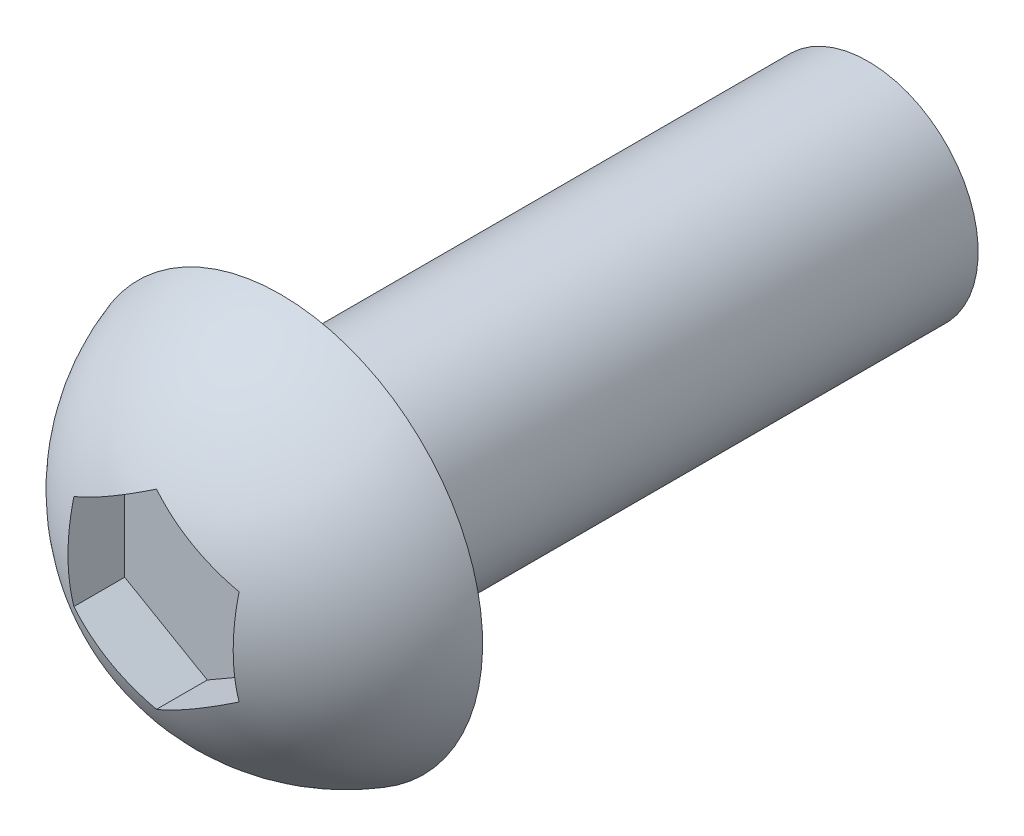
ISO-10303-21;
HEADER;
FILE_DESCRIPTION(('STEP AP214'),'2;1');
FILE_NAME('part.step','',(''),(''),'','','');
FILE_SCHEMA(('AUTOMOTIVE_DESIGN { 1 0 10303 214 1 1 1 1 }'));
ENDSEC;
DATA;
#1=APPLICATION_CONTEXT('core data for automotive mechanical design processes');
#2=APPLICATION_PROTOCOL_DEFINITION('international standard','automotive_design',2000,#1);
#3=PRODUCT_CONTEXT('',#1,'mechanical');
#4=PRODUCT('Part','Part','',(#3));
#5=PRODUCT_RELATED_PRODUCT_CATEGORY('part','',(#4));
#6=PRODUCT_DEFINITION_FORMATION('','',#4);
#7=PRODUCT_DEFINITION_CONTEXT('part definition',#1,'design');
#8=PRODUCT_DEFINITION('design','',#6,#7);
#9=PRODUCT_DEFINITION_SHAPE('','',#8);
#10=(LENGTH_UNIT() NAMED_UNIT(*) SI_UNIT(.MILLI.,.METRE.));
#11=(NAMED_UNIT(*) PLANE_ANGLE_UNIT() SI_UNIT($,.RADIAN.));
#12=(NAMED_UNIT(*) SI_UNIT($,.STERADIAN.) SOLID_ANGLE_UNIT());
#13=UNCERTAINTY_MEASURE_WITH_UNIT(LENGTH_MEASURE(1.E-05),#10,'distance_accuracy_value','');
#14=(GEOMETRIC_REPRESENTATION_CONTEXT(3) GLOBAL_UNCERTAINTY_ASSIGNED_CONTEXT((#13)) GLOBAL_UNIT_ASSIGNED_CONTEXT((#10,
#11,#12)) REPRESENTATION_CONTEXT('',''));
#15=CARTESIAN_POINT('',(0.,0.,0.));
#16=DIRECTION('',(0.,0.,1.));
#17=DIRECTION('',(1.,0.,0.));
#18=AXIS2_PLACEMENT_3D('',#15,#16,#17);
#19=CARTESIAN_POINT('',(0.,0.,-5.));
#20=DIRECTION('',(0.,0.,-1.));
#21=DIRECTION('',(-1.,0.,0.));
#22=AXIS2_PLACEMENT_3D('',#19,#20,#21);
#23=PLANE('',#22);
#24=CARTESIAN_POINT('',(0.,0.,-5.));
#25=DIRECTION('',(0.,0.,-1.));
#26=DIRECTION('',(-1.,0.,0.));
#27=AXIS2_PLACEMENT_3D('',#24,#25,#26);
#28=CIRCLE('',#27,1.5);
#29=CARTESIAN_POINT('',(-1.5,0.,-5.));
#30=VERTEX_POINT('',#29);
#31=EDGE_CURVE('E157',#30,#30,#28,.T.);
#32=ORIENTED_EDGE('',*,*,#31,.T.);
#33=EDGE_LOOP('',(#32));
#34=FACE_BOUND('',#33,.T.);
#35=ADVANCED_FACE('F45',(#34),#23,.T.);
#36=CARTESIAN_POINT('',(0.,0.,3.));
#37=DIRECTION('',(0.,0.,-1.));
#38=DIRECTION('',(-1.,0.,0.));
#39=AXIS2_PLACEMENT_3D('',#36,#37,#38);
#40=CYLINDRICAL_SURFACE('',#39,1.5);
#41=CARTESIAN_POINT('',(0.,0.,3.));
#42=DIRECTION('',(0.,0.,-1.));
#43=DIRECTION('',(-1.,0.,0.));
#44=AXIS2_PLACEMENT_3D('',#41,#42,#43);
#45=CIRCLE('',#44,1.5);
#46=CARTESIAN_POINT('',(-1.5,0.,3.));
#47=VERTEX_POINT('',#46);
#48=EDGE_CURVE('E153',#47,#47,#45,.T.);
#49=ORIENTED_EDGE('',*,*,#48,.T.);
#50=EDGE_LOOP('',(#49));
#51=FACE_BOUND('',#50,.T.);
#52=ORIENTED_EDGE('',*,*,#31,.F.);
#53=EDGE_LOOP('',(#52));
#54=FACE_BOUND('',#53,.T.);
#55=ADVANCED_FACE('F197',(#51,#54),#40,.T.);
#56=CARTESIAN_POINT('',(0.,1.5,3.));
#57=DIRECTION('',(0.,0.,-1.));
#58=DIRECTION('',(-1.,0.,0.));
#59=AXIS2_PLACEMENT_3D('',#56,#57,#58);
#60=PLANE('',#59);
#61=CARTESIAN_POINT('',(0.,0.,3.));
#62=DIRECTION('',(0.,0.,-1.));
#63=DIRECTION('',(-1.,0.,0.));
#64=AXIS2_PLACEMENT_3D('',#61,#62,#63);
#65=CIRCLE('',#64,2.75);
#66=CARTESIAN_POINT('',(-2.75,0.,3.));
#67=VERTEX_POINT('',#66);
#68=EDGE_CURVE('E136',#67,#67,#65,.T.);
#69=ORIENTED_EDGE('',*,*,#68,.T.);
#70=EDGE_LOOP('',(#69));
#71=FACE_BOUND('',#70,.T.);
#72=ORIENTED_EDGE('',*,*,#48,.F.);
#73=EDGE_LOOP('',(#72));
#74=FACE_BOUND('',#73,.T.);
#75=ADVANCED_FACE('F202',(#71,#74),#60,.T.);
#76=CARTESIAN_POINT('',(0.,0.,2.109375));
#77=DIRECTION('',(0.,0.,-1.));
#78=DIRECTION('',(0.,1.,0.));
#79=AXIS2_PLACEMENT_3D('',#76,#77,#78);
#80=SPHERICAL_SURFACE('',#79,2.890625);
#81=CARTESIAN_POINT('',(0.5625,0.974278579257494,2.109375));
#82=DIRECTION('',(0.5,0.866025403784439,0.));
#83=DIRECTION('',(-0.866025403784439,0.5,0.));
#84=AXIS2_PLACEMENT_3D('',#81,#82,#83);
#85=CIRCLE('',#84,2.66272189509626);
#86=CARTESIAN_POINT('',(1.125,0.649519052838329,4.69166330509395));
#87=VERTEX_POINT('',#86);
#88=CARTESIAN_POINT('',(0.,1.29903810567666,4.69166330509395));
#89=VERTEX_POINT('',#88);
#90=EDGE_CURVE('E11',#87,#89,#85,.F.);
#91=ORIENTED_EDGE('',*,*,#90,.F.);
#92=CARTESIAN_POINT('',(1.125,0.,2.109375));
#93=DIRECTION('',(1.,0.,0.));
#94=DIRECTION('',(0.,0.,-1.));
#95=AXIS2_PLACEMENT_3D('',#92,#93,#94);
#96=CIRCLE('',#95,2.66272189509626);
#97=CARTESIAN_POINT('',(1.125,-0.649519052838329,4.69166330509395));
#98=VERTEX_POINT('',#97);
#99=EDGE_CURVE('E53',#98,#87,#96,.F.);
#100=ORIENTED_EDGE('',*,*,#99,.F.);
#101=CARTESIAN_POINT('',(0.5625,-0.974278579257494,2.109375));
#102=DIRECTION('',(0.5,-0.866025403784439,0.));
#103=DIRECTION('',(0.866025403784439,0.5,0.));
#104=AXIS2_PLACEMENT_3D('',#101,#102,#103);
#105=CIRCLE('',#104,2.66272189509626);
#106=CARTESIAN_POINT('',(0.,-1.29903810567666,4.69166330509395));
#107=VERTEX_POINT('',#106);
#108=EDGE_CURVE('E170',#107,#98,#105,.F.);
#109=ORIENTED_EDGE('',*,*,#108,.F.);
#110=CARTESIAN_POINT('',(-0.5625,-0.974278579257495,2.109375));
#111=DIRECTION('',(-0.5,-0.866025403784439,0.));
#112=DIRECTION('',(0.866025403784439,-0.5,0.));
#113=AXIS2_PLACEMENT_3D('',#110,#111,#112);
#114=CIRCLE('',#113,2.66272189509626);
#115=CARTESIAN_POINT('',(-1.125,-0.64951905283833,4.69166330509395));
#116=VERTEX_POINT('',#115);
#117=EDGE_CURVE('E167',#116,#107,#114,.F.);
#118=ORIENTED_EDGE('',*,*,#117,.F.);
#119=CARTESIAN_POINT('',(-1.125,0.,2.109375));
#120=DIRECTION('',(-1.,0.,0.));
#121=DIRECTION('',(0.,0.,1.));
#122=AXIS2_PLACEMENT_3D('',#119,#120,#121);
#123=CIRCLE('',#122,2.66272189509626);
#124=CARTESIAN_POINT('',(-1.125,0.649519052838329,4.69166330509395));
#125=VERTEX_POINT('',#124);
#126=EDGE_CURVE('E164',#125,#116,#123,.F.);
#127=ORIENTED_EDGE('',*,*,#126,.F.);
#128=CARTESIAN_POINT('',(-0.5625,0.974278579257494,2.109375));
#129=DIRECTION('',(-0.5,0.866025403784439,0.));
#130=DIRECTION('',(-0.866025403784438,-0.5,0.));
#131=AXIS2_PLACEMENT_3D('',#128,#129,#130);
#132=CIRCLE('',#131,2.66272189509626);
#133=EDGE_CURVE('E161',#89,#125,#132,.F.);
#134=ORIENTED_EDGE('',*,*,#133,.F.);
#135=EDGE_LOOP('',(#91,#100,#109,#118,#127,#134));
#136=FACE_BOUND('',#135,.T.);
#137=ORIENTED_EDGE('',*,*,#68,.F.);
#138=EDGE_LOOP('',(#137));
#139=FACE_BOUND('',#138,.T.);
#140=ADVANCED_FACE('F180',(#136,#139),#80,.T.);
#141=CARTESIAN_POINT('',(1.125,0.649519052838329,4.));
#142=DIRECTION('',(0.5,0.866025403784439,0.));
#143=DIRECTION('',(-0.866025403784439,0.5,0.));
#144=AXIS2_PLACEMENT_3D('',#141,#142,#143);
#145=PLANE('',#144);
#146=ORIENTED_EDGE('',*,*,#90,.T.);
#147=DIRECTION('',(0.,0.,1.));
#148=VECTOR('',#147,1.);
#149=CARTESIAN_POINT('',(0.,1.29903810567666,4.));
#150=LINE('',#149,#148);
#151=CARTESIAN_POINT('',(0.,1.29903810567666,4.));
#152=VERTEX_POINT('',#151);
#153=EDGE_CURVE('E60',#152,#89,#150,.T.);
#154=ORIENTED_EDGE('',*,*,#153,.F.);
#155=DIRECTION('',(-0.866025403784439,0.5,0.));
#156=VECTOR('',#155,1.);
#157=CARTESIAN_POINT('',(1.125,0.649519052838329,4.));
#158=LINE('',#157,#156);
#159=CARTESIAN_POINT('',(1.125,0.649519052838329,4.));
#160=VERTEX_POINT('',#159);
#161=EDGE_CURVE('E98',#160,#152,#158,.T.);
#162=ORIENTED_EDGE('',*,*,#161,.F.);
#163=DIRECTION('',(0.,0.,1.));
#164=VECTOR('',#163,1.);
#165=CARTESIAN_POINT('',(1.125,0.649519052838329,4.));
#166=LINE('',#165,#164);
#167=EDGE_CURVE('E133',#160,#87,#166,.T.);
#168=ORIENTED_EDGE('',*,*,#167,.T.);
#169=EDGE_LOOP('',(#146,#154,#162,#168));
#170=FACE_BOUND('',#169,.T.);
#171=ADVANCED_FACE('F96',(#170),#145,.F.);
#172=CARTESIAN_POINT('',(1.125,-0.649519052838329,4.));
#173=DIRECTION('',(1.,0.,0.));
#174=DIRECTION('',(0.,0.,-1.));
#175=AXIS2_PLACEMENT_3D('',#172,#173,#174);
#176=PLANE('',#175);
#177=ORIENTED_EDGE('',*,*,#99,.T.);
#178=ORIENTED_EDGE('',*,*,#167,.F.);
#179=DIRECTION('',(0.,1.,0.));
#180=VECTOR('',#179,1.);
#181=CARTESIAN_POINT('',(1.125,-0.649519052838329,4.));
#182=LINE('',#181,#180);
#183=CARTESIAN_POINT('',(1.125,-0.649519052838329,4.));
#184=VERTEX_POINT('',#183);
#185=EDGE_CURVE('E104',#184,#160,#182,.T.);
#186=ORIENTED_EDGE('',*,*,#185,.F.);
#187=DIRECTION('',(0.,0.,1.));
#188=VECTOR('',#187,1.);
#189=CARTESIAN_POINT('',(1.125,-0.649519052838329,4.));
#190=LINE('',#189,#188);
#191=EDGE_CURVE('E137',#184,#98,#190,.T.);
#192=ORIENTED_EDGE('',*,*,#191,.T.);
#193=EDGE_LOOP('',(#177,#178,#186,#192));
#194=FACE_BOUND('',#193,.T.);
#195=ADVANCED_FACE('F179',(#194),#176,.F.);
#196=CARTESIAN_POINT('',(0.,-1.29903810567666,4.));
#197=DIRECTION('',(0.5,-0.866025403784439,0.));
#198=DIRECTION('',(0.866025403784439,0.5,0.));
#199=AXIS2_PLACEMENT_3D('',#196,#197,#198);
#200=PLANE('',#199);
#201=ORIENTED_EDGE('',*,*,#108,.T.);
#202=ORIENTED_EDGE('',*,*,#191,.F.);
#203=DIRECTION('',(0.866025403784439,0.5,0.));
#204=VECTOR('',#203,1.);
#205=CARTESIAN_POINT('',(0.,-1.29903810567666,4.));
#206=LINE('',#205,#204);
#207=CARTESIAN_POINT('',(0.,-1.29903810567666,4.));
#208=VERTEX_POINT('',#207);
#209=EDGE_CURVE('E128',#208,#184,#206,.T.);
#210=ORIENTED_EDGE('',*,*,#209,.F.);
#211=DIRECTION('',(0.,0.,1.));
#212=VECTOR('',#211,1.);
#213=CARTESIAN_POINT('',(0.,-1.29903810567666,4.));
#214=LINE('',#213,#212);
#215=EDGE_CURVE('E140',#208,#107,#214,.T.);
#216=ORIENTED_EDGE('',*,*,#215,.T.);
#217=EDGE_LOOP('',(#201,#202,#210,#216));
#218=FACE_BOUND('',#217,.T.);
#219=ADVANCED_FACE('F175',(#218),#200,.F.);
#220=CARTESIAN_POINT('',(-1.125,-0.64951905283833,4.));
#221=DIRECTION('',(-0.5,-0.866025403784439,0.));
#222=DIRECTION('',(0.866025403784439,-0.5,0.));
#223=AXIS2_PLACEMENT_3D('',#220,#221,#222);
#224=PLANE('',#223);
#225=ORIENTED_EDGE('',*,*,#117,.T.);
#226=ORIENTED_EDGE('',*,*,#215,.F.);
#227=DIRECTION('',(0.866025403784439,-0.5,0.));
#228=VECTOR('',#227,1.);
#229=CARTESIAN_POINT('',(-1.125,-0.64951905283833,4.));
#230=LINE('',#229,#228);
#231=CARTESIAN_POINT('',(-1.125,-0.64951905283833,4.));
#232=VERTEX_POINT('',#231);
#233=EDGE_CURVE('E124',#232,#208,#230,.T.);
#234=ORIENTED_EDGE('',*,*,#233,.F.);
#235=DIRECTION('',(0.,0.,1.));
#236=VECTOR('',#235,1.);
#237=CARTESIAN_POINT('',(-1.125,-0.64951905283833,4.));
#238=LINE('',#237,#236);
#239=EDGE_CURVE('E144',#232,#116,#238,.T.);
#240=ORIENTED_EDGE('',*,*,#239,.T.);
#241=EDGE_LOOP('',(#225,#226,#234,#240));
#242=FACE_BOUND('',#241,.T.);
#243=ADVANCED_FACE('F187',(#242),#224,.F.);
#244=CARTESIAN_POINT('',(-1.125,0.649519052838328,4.));
#245=DIRECTION('',(-1.,0.,0.));
#246=DIRECTION('',(0.,0.,1.));
#247=AXIS2_PLACEMENT_3D('',#244,#245,#246);
#248=PLANE('',#247);
#249=ORIENTED_EDGE('',*,*,#126,.T.);
#250=ORIENTED_EDGE('',*,*,#239,.F.);
#251=DIRECTION('',(0.,-1.,0.));
#252=VECTOR('',#251,1.);
#253=CARTESIAN_POINT('',(-1.125,0.649519052838328,4.));
#254=LINE('',#253,#252);
#255=CARTESIAN_POINT('',(-1.125,0.649519052838328,4.));
#256=VERTEX_POINT('',#255);
#257=EDGE_CURVE('E114',#256,#232,#254,.T.);
#258=ORIENTED_EDGE('',*,*,#257,.F.);
#259=DIRECTION('',(0.,0.,1.));
#260=VECTOR('',#259,1.);
#261=CARTESIAN_POINT('',(-1.125,0.649519052838328,4.));
#262=LINE('',#261,#260);
#263=EDGE_CURVE('E103',#256,#125,#262,.T.);
#264=ORIENTED_EDGE('',*,*,#263,.T.);
#265=EDGE_LOOP('',(#249,#250,#258,#264));
#266=FACE_BOUND('',#265,.T.);
#267=ADVANCED_FACE('F184',(#266),#248,.F.);
#268=CARTESIAN_POINT('',(0.,1.29903810567666,4.));
#269=DIRECTION('',(-0.5,0.866025403784439,0.));
#270=DIRECTION('',(-0.866025403784438,-0.5,0.));
#271=AXIS2_PLACEMENT_3D('',#268,#269,#270);
#272=PLANE('',#271);
#273=ORIENTED_EDGE('',*,*,#133,.T.);
#274=ORIENTED_EDGE('',*,*,#263,.F.);
#275=DIRECTION('',(-0.866025403784438,-0.5,0.));
#276=VECTOR('',#275,1.);
#277=CARTESIAN_POINT('',(0.,1.29903810567666,4.));
#278=LINE('',#277,#276);
#279=EDGE_CURVE('E107',#152,#256,#278,.T.);
#280=ORIENTED_EDGE('',*,*,#279,.F.);
#281=ORIENTED_EDGE('',*,*,#153,.T.);
#282=EDGE_LOOP('',(#273,#274,#280,#281));
#283=FACE_BOUND('',#282,.T.);
#284=ADVANCED_FACE('F108',(#283),#272,.F.);
#285=CARTESIAN_POINT('',(0.,0.,4.));
#286=DIRECTION('',(0.,0.,1.));
#287=DIRECTION('',(1.,0.,0.));
#288=AXIS2_PLACEMENT_3D('',#285,#286,#287);
#289=PLANE('',#288);
#290=ORIENTED_EDGE('',*,*,#161,.T.);
#291=ORIENTED_EDGE('',*,*,#279,.T.);
#292=ORIENTED_EDGE('',*,*,#257,.T.);
#293=ORIENTED_EDGE('',*,*,#233,.T.);
#294=ORIENTED_EDGE('',*,*,#209,.T.);
#295=ORIENTED_EDGE('',*,*,#185,.T.);
#296=EDGE_LOOP('',(#290,#291,#292,#293,#294,#295));
#297=FACE_BOUND('',#296,.T.);
#298=ADVANCED_FACE('F116',(#297),#289,.T.);
#299=CLOSED_SHELL('',(#35,#55,#75,#140,#171,#195,#219,#243,#267,#284,#298));
#300=MANIFOLD_SOLID_BREP('B2',#299);
#301=ADVANCED_BREP_SHAPE_REPRESENTATION('',(#18,#300),#14);
#302=SHAPE_DEFINITION_REPRESENTATION(#9,#301);
ENDSEC;
END-ISO-10303-21;
